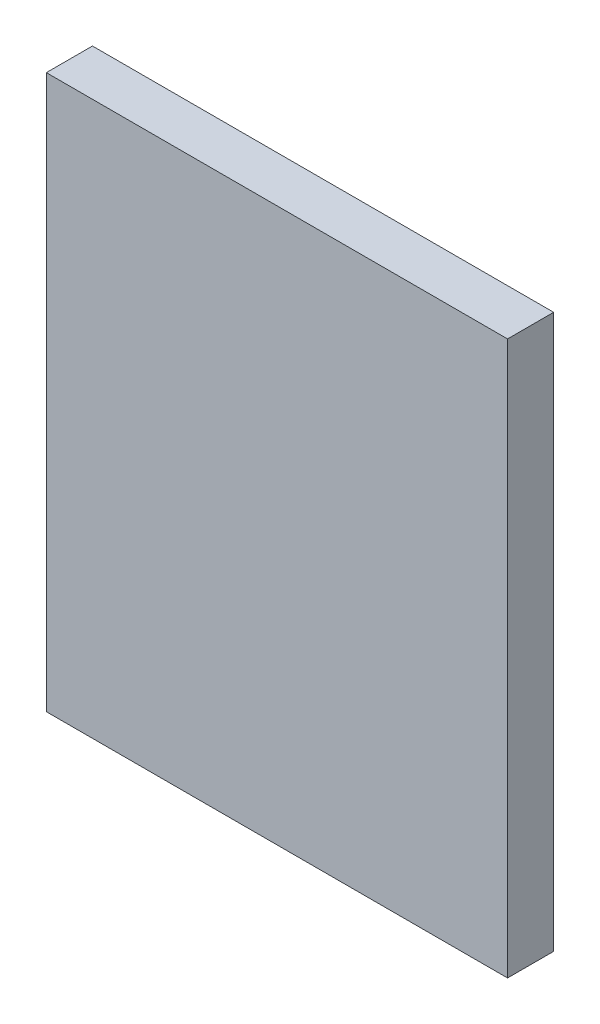
ISO-10303-21;
HEADER;
FILE_DESCRIPTION(('STEP AP214'),'2;1');
FILE_NAME('part.step','',(''),(''),'','','');
FILE_SCHEMA(('AUTOMOTIVE_DESIGN { 1 0 10303 214 1 1 1 1 }'));
ENDSEC;
DATA;
#1=APPLICATION_CONTEXT('core data for automotive mechanical design processes');
#2=APPLICATION_PROTOCOL_DEFINITION('international standard','automotive_design',2000,#1);
#3=PRODUCT_CONTEXT('',#1,'mechanical');
#4=PRODUCT('Part','Part','',(#3));
#5=PRODUCT_RELATED_PRODUCT_CATEGORY('part','',(#4));
#6=PRODUCT_DEFINITION_FORMATION('','',#4);
#7=PRODUCT_DEFINITION_CONTEXT('part definition',#1,'design');
#8=PRODUCT_DEFINITION('design','',#6,#7);
#9=PRODUCT_DEFINITION_SHAPE('','',#8);
#10=(LENGTH_UNIT() NAMED_UNIT(*) SI_UNIT(.MILLI.,.METRE.));
#11=(NAMED_UNIT(*) PLANE_ANGLE_UNIT() SI_UNIT($,.RADIAN.));
#12=(NAMED_UNIT(*) SI_UNIT($,.STERADIAN.) SOLID_ANGLE_UNIT());
#13=UNCERTAINTY_MEASURE_WITH_UNIT(LENGTH_MEASURE(1.E-05),#10,'distance_accuracy_value','');
#14=(GEOMETRIC_REPRESENTATION_CONTEXT(3) GLOBAL_UNCERTAINTY_ASSIGNED_CONTEXT((#13)) GLOBAL_UNIT_ASSIGNED_CONTEXT((#10,
#11,#12)) REPRESENTATION_CONTEXT('',''));
#15=CARTESIAN_POINT('',(0.,0.,0.));
#16=DIRECTION('',(0.,0.,1.));
#17=DIRECTION('',(1.,0.,0.));
#18=AXIS2_PLACEMENT_3D('',#15,#16,#17);
#19=CARTESIAN_POINT('',(127.,304.8,-12.7));
#20=DIRECTION('',(-1.,0.,0.));
#21=DIRECTION('',(0.,0.,1.));
#22=AXIS2_PLACEMENT_3D('',#19,#20,#21);
#23=PLANE('',#22);
#24=DIRECTION('',(0.,0.,-1.));
#25=VECTOR('',#24,1.);
#26=CARTESIAN_POINT('',(127.,0.,-12.7));
#27=LINE('',#26,#25);
#28=CARTESIAN_POINT('',(127.,0.,12.7));
#29=VERTEX_POINT('',#28);
#30=CARTESIAN_POINT('',(127.,0.,-12.7));
#31=VERTEX_POINT('',#30);
#32=EDGE_CURVE('E107',#29,#31,#27,.T.);
#33=ORIENTED_EDGE('',*,*,#32,.T.);
#34=DIRECTION('',(0.,-1.,0.));
#35=VECTOR('',#34,1.);
#36=CARTESIAN_POINT('',(127.,304.8,-12.7));
#37=LINE('',#36,#35);
#38=CARTESIAN_POINT('',(127.,304.8,-12.7));
#39=VERTEX_POINT('',#38);
#40=EDGE_CURVE('E11',#39,#31,#37,.T.);
#41=ORIENTED_EDGE('',*,*,#40,.F.);
#42=DIRECTION('',(0.,0.,-1.));
#43=VECTOR('',#42,1.);
#44=CARTESIAN_POINT('',(127.,304.8,-12.7));
#45=LINE('',#44,#43);
#46=CARTESIAN_POINT('',(127.,304.8,12.7));
#47=VERTEX_POINT('',#46);
#48=EDGE_CURVE('E91',#47,#39,#45,.T.);
#49=ORIENTED_EDGE('',*,*,#48,.F.);
#50=DIRECTION('',(0.,-1.,0.));
#51=VECTOR('',#50,1.);
#52=CARTESIAN_POINT('',(127.,304.8,12.7));
#53=LINE('',#52,#51);
#54=EDGE_CURVE('E103',#47,#29,#53,.T.);
#55=ORIENTED_EDGE('',*,*,#54,.T.);
#56=EDGE_LOOP('',(#33,#41,#49,#55));
#57=FACE_BOUND('',#56,.T.);
#58=ADVANCED_FACE('F39',(#57),#23,.F.);
#59=CARTESIAN_POINT('',(-127.,304.8,-12.7));
#60=DIRECTION('',(0.,0.,1.));
#61=DIRECTION('',(1.,0.,0.));
#62=AXIS2_PLACEMENT_3D('',#59,#60,#61);
#63=PLANE('',#62);
#64=DIRECTION('',(-1.,0.,0.));
#65=VECTOR('',#64,1.);
#66=CARTESIAN_POINT('',(-127.,0.,-12.7));
#67=LINE('',#66,#65);
#68=CARTESIAN_POINT('',(-127.,0.,-12.7));
#69=VERTEX_POINT('',#68);
#70=EDGE_CURVE('E96',#31,#69,#67,.T.);
#71=ORIENTED_EDGE('',*,*,#70,.T.);
#72=DIRECTION('',(0.,-1.,0.));
#73=VECTOR('',#72,1.);
#74=CARTESIAN_POINT('',(-127.,304.8,-12.7));
#75=LINE('',#74,#73);
#76=CARTESIAN_POINT('',(-127.,304.8,-12.7));
#77=VERTEX_POINT('',#76);
#78=EDGE_CURVE('E48',#77,#69,#75,.T.);
#79=ORIENTED_EDGE('',*,*,#78,.F.);
#80=DIRECTION('',(-1.,0.,0.));
#81=VECTOR('',#80,1.);
#82=CARTESIAN_POINT('',(-127.,304.8,-12.7));
#83=LINE('',#82,#81);
#84=EDGE_CURVE('E86',#39,#77,#83,.T.);
#85=ORIENTED_EDGE('',*,*,#84,.F.);
#86=ORIENTED_EDGE('',*,*,#40,.T.);
#87=EDGE_LOOP('',(#71,#79,#85,#86));
#88=FACE_BOUND('',#87,.T.);
#89=ADVANCED_FACE('F95',(#88),#63,.F.);
#90=CARTESIAN_POINT('',(-127.,304.8,-12.7));
#91=DIRECTION('',(1.,0.,0.));
#92=DIRECTION('',(0.,0.,-1.));
#93=AXIS2_PLACEMENT_3D('',#90,#91,#92);
#94=PLANE('',#93);
#95=DIRECTION('',(0.,0.,1.));
#96=VECTOR('',#95,1.);
#97=CARTESIAN_POINT('',(-127.,0.,-12.7));
#98=LINE('',#97,#96);
#99=CARTESIAN_POINT('',(-127.,0.,12.7));
#100=VERTEX_POINT('',#99);
#101=EDGE_CURVE('E73',#69,#100,#98,.T.);
#102=ORIENTED_EDGE('',*,*,#101,.T.);
#103=DIRECTION('',(0.,-1.,0.));
#104=VECTOR('',#103,1.);
#105=CARTESIAN_POINT('',(-127.,304.8,12.7));
#106=LINE('',#105,#104);
#107=CARTESIAN_POINT('',(-127.,304.8,12.7));
#108=VERTEX_POINT('',#107);
#109=EDGE_CURVE('E98',#108,#100,#106,.T.);
#110=ORIENTED_EDGE('',*,*,#109,.F.);
#111=DIRECTION('',(0.,0.,1.));
#112=VECTOR('',#111,1.);
#113=CARTESIAN_POINT('',(-127.,304.8,-12.7));
#114=LINE('',#113,#112);
#115=EDGE_CURVE('E89',#77,#108,#114,.T.);
#116=ORIENTED_EDGE('',*,*,#115,.F.);
#117=ORIENTED_EDGE('',*,*,#78,.T.);
#118=EDGE_LOOP('',(#102,#110,#116,#117));
#119=FACE_BOUND('',#118,.T.);
#120=ADVANCED_FACE('F99',(#119),#94,.F.);
#121=CARTESIAN_POINT('',(-127.,304.8,12.7));
#122=DIRECTION('',(0.,0.,-1.));
#123=DIRECTION('',(-1.,0.,0.));
#124=AXIS2_PLACEMENT_3D('',#121,#122,#123);
#125=PLANE('',#124);
#126=DIRECTION('',(1.,0.,0.));
#127=VECTOR('',#126,1.);
#128=CARTESIAN_POINT('',(-127.,0.,12.7));
#129=LINE('',#128,#127);
#130=EDGE_CURVE('E79',#100,#29,#129,.T.);
#131=ORIENTED_EDGE('',*,*,#130,.T.);
#132=ORIENTED_EDGE('',*,*,#54,.F.);
#133=DIRECTION('',(1.,0.,0.));
#134=VECTOR('',#133,1.);
#135=CARTESIAN_POINT('',(-127.,304.8,12.7));
#136=LINE('',#135,#134);
#137=EDGE_CURVE('E56',#108,#47,#136,.T.);
#138=ORIENTED_EDGE('',*,*,#137,.F.);
#139=ORIENTED_EDGE('',*,*,#109,.T.);
#140=EDGE_LOOP('',(#131,#132,#138,#139));
#141=FACE_BOUND('',#140,.T.);
#142=ADVANCED_FACE('F120',(#141),#125,.F.);
#143=CARTESIAN_POINT('',(0.,304.8,0.));
#144=DIRECTION('',(0.,1.,0.));
#145=DIRECTION('',(0.,0.,1.));
#146=AXIS2_PLACEMENT_3D('',#143,#144,#145);
#147=PLANE('',#146);
#148=ORIENTED_EDGE('',*,*,#48,.T.);
#149=ORIENTED_EDGE('',*,*,#84,.T.);
#150=ORIENTED_EDGE('',*,*,#115,.T.);
#151=ORIENTED_EDGE('',*,*,#137,.T.);
#152=EDGE_LOOP('',(#148,#149,#150,#151));
#153=FACE_BOUND('',#152,.T.);
#154=ADVANCED_FACE('F87',(#153),#147,.T.);
#155=CARTESIAN_POINT('',(0.,0.,0.));
#156=DIRECTION('',(0.,1.,0.));
#157=DIRECTION('',(0.,0.,1.));
#158=AXIS2_PLACEMENT_3D('',#155,#156,#157);
#159=PLANE('',#158);
#160=ORIENTED_EDGE('',*,*,#32,.F.);
#161=ORIENTED_EDGE('',*,*,#130,.F.);
#162=ORIENTED_EDGE('',*,*,#101,.F.);
#163=ORIENTED_EDGE('',*,*,#70,.F.);
#164=EDGE_LOOP('',(#160,#161,#162,#163));
#165=FACE_BOUND('',#164,.T.);
#166=ADVANCED_FACE('F123',(#165),#159,.F.);
#167=CLOSED_SHELL('',(#58,#89,#120,#142,#154,#166));
#168=MANIFOLD_SOLID_BREP('B2',#167);
#169=ADVANCED_BREP_SHAPE_REPRESENTATION('',(#18,#168),#14);
#170=SHAPE_DEFINITION_REPRESENTATION(#9,#169);
ENDSEC;
END-ISO-10303-21;
